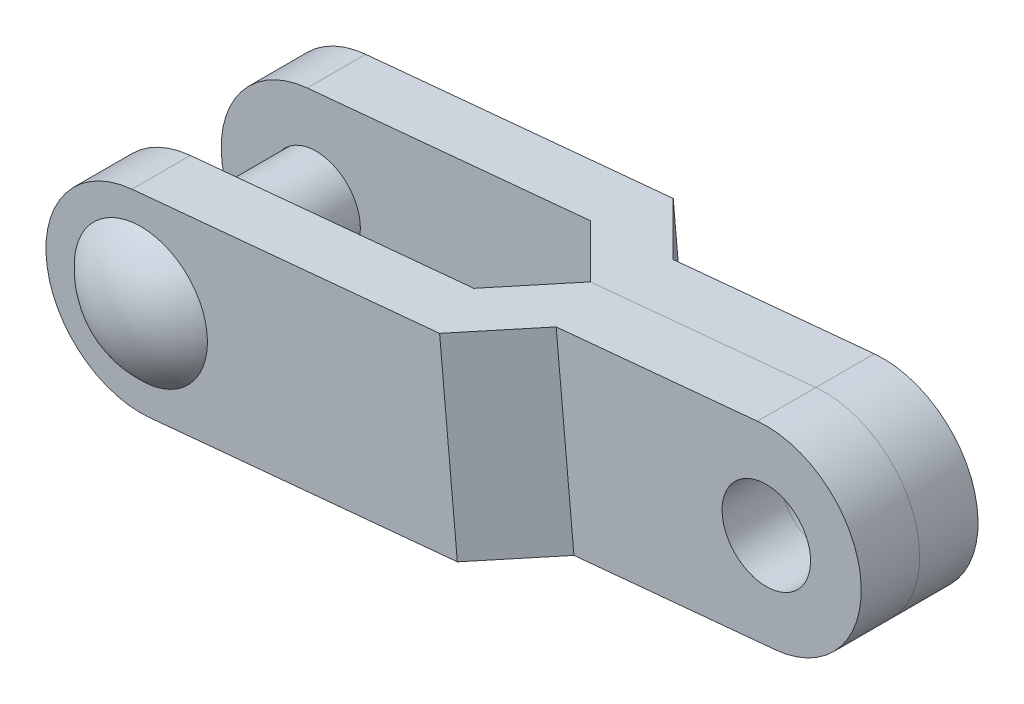
ISO-10303-21;
HEADER;
FILE_DESCRIPTION(('STEP AP214'),'2;1');
FILE_NAME('part.step','',(''),(''),'','','');
FILE_SCHEMA(('AUTOMOTIVE_DESIGN { 1 0 10303 214 1 1 1 1 }'));
ENDSEC;
DATA;
#1=APPLICATION_CONTEXT('core data for automotive mechanical design processes');
#2=APPLICATION_PROTOCOL_DEFINITION('international standard','automotive_design',2000,#1);
#3=PRODUCT_CONTEXT('',#1,'mechanical');
#4=PRODUCT('Part','Part','',(#3));
#5=PRODUCT_RELATED_PRODUCT_CATEGORY('part','',(#4));
#6=PRODUCT_DEFINITION_FORMATION('','',#4);
#7=PRODUCT_DEFINITION_CONTEXT('part definition',#1,'design');
#8=PRODUCT_DEFINITION('design','',#6,#7);
#9=PRODUCT_DEFINITION_SHAPE('','',#8);
#10=(LENGTH_UNIT() NAMED_UNIT(*) SI_UNIT(.MILLI.,.METRE.));
#11=(NAMED_UNIT(*) PLANE_ANGLE_UNIT() SI_UNIT($,.RADIAN.));
#12=(NAMED_UNIT(*) SI_UNIT($,.STERADIAN.) SOLID_ANGLE_UNIT());
#13=UNCERTAINTY_MEASURE_WITH_UNIT(LENGTH_MEASURE(1.E-05),#10,'distance_accuracy_value','');
#14=(GEOMETRIC_REPRESENTATION_CONTEXT(3) GLOBAL_UNCERTAINTY_ASSIGNED_CONTEXT((#13)) GLOBAL_UNIT_ASSIGNED_CONTEXT((#10,
#11,#12)) REPRESENTATION_CONTEXT('',''));
#15=CARTESIAN_POINT('',(0.,0.,0.));
#16=DIRECTION('',(0.,0.,1.));
#17=DIRECTION('',(1.,0.,0.));
#18=AXIS2_PLACEMENT_3D('',#15,#16,#17);
#19=CARTESIAN_POINT('',(33.5654439360264,20.3671347385643,2.00000000000023));
#20=DIRECTION('',(0.,0.,-1.));
#21=DIRECTION('',(-0.995601491019993,-0.0936892260549193,0.));
#22=AXIS2_PLACEMENT_3D('',#19,#20,#21);
#23=PLANE('',#22);
#24=CARTESIAN_POINT('',(30.6342290748899,16.8269399080709,2.00000000000026));
#25=DIRECTION('',(0.,0.,-1.));
#26=DIRECTION('',(-0.995601491019993,-0.0936892260549193,0.));
#27=AXIS2_PLACEMENT_3D('',#24,#25,#26);
#28=CIRCLE('',#27,1.515);
#29=CARTESIAN_POINT('',(32.1425653337852,16.9688790855441,2.00000000000024));
#30=VERTEX_POINT('',#29);
#31=EDGE_CURVE('P0_E135',#30,#30,#28,.T.);
#32=ORIENTED_EDGE('',*,*,#31,.T.);
#33=EDGE_LOOP('',(#32));
#34=FACE_BOUND('',#33,.T.);
#35=CARTESIAN_POINT('',(30.6342290748899,16.8269399080709,2.00000000000026));
#36=DIRECTION('',(0.,0.,-1.));
#37=DIRECTION('',(-0.995601491019993,-0.0936892260549193,0.));
#38=AXIS2_PLACEMENT_3D('',#35,#36,#37);
#39=CIRCLE('',#38,3.24999999999999);
#40=CARTESIAN_POINT('',(30.3297390902114,20.0626447538858,2.00000000000027));
#41=VERTEX_POINT('',#40);
#42=CARTESIAN_POINT('',(30.9387190595684,13.5912350622559,2.00000000000026));
#43=VERTEX_POINT('',#42);
#44=EDGE_CURVE('P0_E31',#41,#43,#39,.T.);
#45=ORIENTED_EDGE('',*,*,#44,.F.);
#46=DIRECTION('',(0.995601491019993,0.0936892260549193,0.));
#47=VECTOR('',#46,1.);
#48=CARTESIAN_POINT('',(33.5654439360264,20.3671347385643,2.00000000000023));
#49=LINE('',#48,#47);
#50=CARTESIAN_POINT('',(23.438610815405,19.4141679481206,2.00000000000033));
#51=VERTEX_POINT('',#50);
#52=EDGE_CURVE('P0_E145',#51,#41,#49,.T.);
#53=ORIENTED_EDGE('',*,*,#52,.F.);
#54=DIRECTION('',(0.0936892260549193,-0.995601491019993,0.));
#55=VECTOR('',#54,1.);
#56=CARTESIAN_POINT('',(23.438610815405,19.4141679481206,2.00000000000033));
#57=LINE('',#56,#55);
#58=CARTESIAN_POINT('',(24.0475907847619,12.9427582564906,2.00000000000034));
#59=VERTEX_POINT('',#58);
#60=EDGE_CURVE('P0_E130',#51,#59,#57,.T.);
#61=ORIENTED_EDGE('',*,*,#60,.T.);
#62=DIRECTION('',(0.995601491019993,0.0936892260549193,0.));
#63=VECTOR('',#62,1.);
#64=CARTESIAN_POINT('',(34.1744239053834,13.8957250469344,2.00000000000023));
#65=LINE('',#64,#63);
#66=EDGE_CURVE('P0_E111',#59,#43,#65,.T.);
#67=ORIENTED_EDGE('',*,*,#66,.T.);
#68=EDGE_LOOP('',(#45,#53,#61,#67));
#69=FACE_BOUND('',#68,.T.);
#70=ADVANCED_FACE('P0_F16',(#34,#69),#23,.F.);
#71=CARTESIAN_POINT('',(22.6138275348065,19.3365532519602,1.74187481183223E-13));
#72=DIRECTION('',(0.,0.,1.));
#73=DIRECTION('',(0.0936892260549193,-0.995601491019993,0.));
#74=AXIS2_PLACEMENT_3D('',#71,#72,#73);
#75=PLANE('',#74);
#76=CARTESIAN_POINT('',(30.6342290748899,16.8269399080709,1.11586825570534E-13));
#77=DIRECTION('',(0.,0.,1.));
#78=DIRECTION('',(0.0936892260549193,-0.995601491019993,0.));
#79=AXIS2_PLACEMENT_3D('',#76,#77,#78);
#80=CIRCLE('',#79,1.515);
#81=CARTESIAN_POINT('',(32.1425653337852,16.9688790855441,1.00613961606655E-13));
#82=VERTEX_POINT('',#81);
#83=EDGE_CURVE('P0_E133',#82,#82,#80,.T.);
#84=ORIENTED_EDGE('',*,*,#83,.T.);
#85=EDGE_LOOP('',(#84));
#86=FACE_BOUND('',#85,.T.);
#87=CARTESIAN_POINT('',(30.6342290748899,16.8269399080709,1.11586825570534E-13));
#88=DIRECTION('',(0.,0.,1.));
#89=DIRECTION('',(0.0936892260549193,-0.995601491019993,0.));
#90=AXIS2_PLACEMENT_3D('',#87,#88,#89);
#91=CIRCLE('',#90,3.24999999999999);
#92=CARTESIAN_POINT('',(30.9387190595684,13.5912350622559,1.11523091135607E-13));
#93=VERTEX_POINT('',#92);
#94=CARTESIAN_POINT('',(30.3297390902114,20.0626447538858,1.12517921743449E-13));
#95=VERTEX_POINT('',#94);
#96=EDGE_CURVE('P0_E95',#93,#95,#91,.T.);
#97=ORIENTED_EDGE('',*,*,#96,.F.);
#98=DIRECTION('',(-0.995601491019993,-0.0936892260549193,0.));
#99=VECTOR('',#98,1.);
#100=CARTESIAN_POINT('',(23.2228075041634,12.8651435603303,1.74060012313369E-13));
#101=LINE('',#100,#99);
#102=CARTESIAN_POINT('',(23.2228075041634,12.8651435603303,1.74060012313369E-13));
#103=VERTEX_POINT('',#102);
#104=EDGE_CURVE('P0_E115',#93,#103,#101,.T.);
#105=ORIENTED_EDGE('',*,*,#104,.T.);
#106=DIRECTION('',(0.0936892260549193,-0.995601491019993,0.));
#107=VECTOR('',#106,1.);
#108=CARTESIAN_POINT('',(22.6138275348065,19.3365532519602,1.74187481183223E-13));
#109=LINE('',#108,#107);
#110=CARTESIAN_POINT('',(22.6138275348065,19.3365532519602,1.74187481183223E-13));
#111=VERTEX_POINT('',#110);
#112=EDGE_CURVE('P0_E127',#111,#103,#109,.T.);
#113=ORIENTED_EDGE('',*,*,#112,.F.);
#114=DIRECTION('',(-0.995601491019993,-0.0936892260549193,0.));
#115=VECTOR('',#114,1.);
#116=CARTESIAN_POINT('',(22.6138275348065,19.3365532519602,1.74187481183223E-13));
#117=LINE('',#116,#115);
#118=EDGE_CURVE('P0_E158',#95,#111,#117,.T.);
#119=ORIENTED_EDGE('',*,*,#118,.F.);
#120=EDGE_LOOP('',(#97,#105,#113,#119));
#121=FACE_BOUND('',#120,.T.);
#122=ADVANCED_FACE('P0_F157',(#86,#121),#75,.F.);
#123=CARTESIAN_POINT('',(20.6226245527666,19.1491747998504,2.0000000000003));
#124=DIRECTION('',(0.,0.,1.));
#125=DIRECTION('',(0.995601491019993,0.0936892260549193,0.));
#126=AXIS2_PLACEMENT_3D('',#123,#124,#125);
#127=PLANE('',#126);
#128=CARTESIAN_POINT('',(11.22,14.9999999999999,2.00000000000034));
#129=DIRECTION('',(0.,0.,1.));
#130=DIRECTION('',(0.995601491019993,0.0936892260549193,0.));
#131=AXIS2_PLACEMENT_3D('',#128,#129,#130);
#132=CIRCLE('',#131,1.515);
#133=CARTESIAN_POINT('',(12.7283362588953,15.1419391774731,2.00000000000034));
#134=VERTEX_POINT('',#133);
#135=EDGE_CURVE('P0_E112',#134,#134,#132,.T.);
#136=ORIENTED_EDGE('',*,*,#135,.T.);
#137=EDGE_LOOP('',(#136));
#138=FACE_BOUND('',#137,.T.);
#139=CARTESIAN_POINT('',(11.22,14.9999999999999,2.00000000000034));
#140=DIRECTION('',(0.,0.,1.));
#141=DIRECTION('',(0.995601491019993,0.0936892260549193,0.));
#142=AXIS2_PLACEMENT_3D('',#139,#140,#141);
#143=CIRCLE('',#142,3.24999999999999);
#144=CARTESIAN_POINT('',(10.9155100153216,18.2357048458149,2.00000000000035));
#145=VERTEX_POINT('',#144);
#146=CARTESIAN_POINT('',(11.5244899846785,11.764295154185,2.00000000000034));
#147=VERTEX_POINT('',#146);
#148=EDGE_CURVE('P0_E38',#145,#147,#143,.T.);
#149=ORIENTED_EDGE('',*,*,#148,.F.);
#150=DIRECTION('',(-0.995601491019993,-0.0936892260549193,0.));
#151=VECTOR('',#150,1.);
#152=CARTESIAN_POINT('',(20.6226245527666,19.1491747998504,2.0000000000003));
#153=LINE('',#152,#151);
#154=CARTESIAN_POINT('',(20.6226245527666,19.1491747998504,2.0000000000003));
#155=VERTEX_POINT('',#154);
#156=EDGE_CURVE('P0_E94',#155,#145,#153,.T.);
#157=ORIENTED_EDGE('',*,*,#156,.F.);
#158=DIRECTION('',(0.0936892260549193,-0.995601491019993,0.));
#159=VECTOR('',#158,1.);
#160=CARTESIAN_POINT('',(20.6226245527666,19.1491747998504,2.0000000000003));
#161=LINE('',#160,#159);
#162=CARTESIAN_POINT('',(21.2316045221236,12.6777651082205,2.0000000000003));
#163=VERTEX_POINT('',#162);
#164=EDGE_CURVE('P0_E102',#155,#163,#161,.T.);
#165=ORIENTED_EDGE('',*,*,#164,.T.);
#166=DIRECTION('',(-0.995601491019993,-0.0936892260549193,0.));
#167=VECTOR('',#166,1.);
#168=CARTESIAN_POINT('',(21.2316045221236,12.6777651082205,2.0000000000003));
#169=LINE('',#168,#167);
#170=EDGE_CURVE('P0_E119',#163,#147,#169,.T.);
#171=ORIENTED_EDGE('',*,*,#170,.T.);
#172=EDGE_LOOP('',(#149,#157,#165,#171));
#173=FACE_BOUND('',#172,.T.);
#174=ADVANCED_FACE('P0_F149',(#138,#173),#127,.F.);
#175=CARTESIAN_POINT('',(21.4474078333653,19.2267894960108,4.00000000000036));
#176=DIRECTION('',(0.,0.,-1.));
#177=DIRECTION('',(-0.995601491019993,-0.0936892260549193,0.));
#178=AXIS2_PLACEMENT_3D('',#175,#176,#177);
#179=PLANE('',#178);
#180=CARTESIAN_POINT('',(11.22,14.9999999999999,4.00000000000035));
#181=DIRECTION('',(0.,0.,1.));
#182=DIRECTION('',(0.995601491019993,0.0936892260549193,0.));
#183=AXIS2_PLACEMENT_3D('',#180,#181,#182);
#184=CIRCLE('',#183,1.515);
#185=CARTESIAN_POINT('',(12.7283362588953,15.1419391774731,4.00000000000035));
#186=VERTEX_POINT('',#185);
#187=EDGE_CURVE('P0_E167',#186,#186,#184,.T.);
#188=ORIENTED_EDGE('',*,*,#187,.F.);
#189=EDGE_LOOP('',(#188));
#190=FACE_BOUND('',#189,.T.);
#191=CARTESIAN_POINT('',(11.22,14.9999999999999,4.00000000000035));
#192=DIRECTION('',(0.,0.,1.));
#193=DIRECTION('',(0.995601491019993,0.0936892260549193,0.));
#194=AXIS2_PLACEMENT_3D('',#191,#192,#193);
#195=CIRCLE('',#194,3.24999999999999);
#196=CARTESIAN_POINT('',(10.9155100153216,18.2357048458149,4.00000000000035));
#197=VERTEX_POINT('',#196);
#198=CARTESIAN_POINT('',(11.5244899846786,11.764295154185,4.00000000000035));
#199=VERTEX_POINT('',#198);
#200=EDGE_CURVE('P0_E78',#197,#199,#195,.T.);
#201=ORIENTED_EDGE('',*,*,#200,.T.);
#202=DIRECTION('',(0.995601491019993,0.0936892260549193,0.));
#203=VECTOR('',#202,1.);
#204=CARTESIAN_POINT('',(22.0563878027223,12.7553798043808,4.00000000000036));
#205=LINE('',#204,#203);
#206=CARTESIAN_POINT('',(22.0563878027223,12.7553798043808,4.00000000000036));
#207=VERTEX_POINT('',#206);
#208=EDGE_CURVE('P0_E122',#199,#207,#205,.T.);
#209=ORIENTED_EDGE('',*,*,#208,.T.);
#210=DIRECTION('',(0.0936892260549193,-0.995601491019993,0.));
#211=VECTOR('',#210,1.);
#212=CARTESIAN_POINT('',(21.4474078333653,19.2267894960108,4.00000000000036));
#213=LINE('',#212,#211);
#214=CARTESIAN_POINT('',(21.4474078333653,19.2267894960108,4.00000000000036));
#215=VERTEX_POINT('',#214);
#216=EDGE_CURVE('P0_E99',#215,#207,#213,.T.);
#217=ORIENTED_EDGE('',*,*,#216,.F.);
#218=DIRECTION('',(0.995601491019993,0.0936892260549193,0.));
#219=VECTOR('',#218,1.);
#220=CARTESIAN_POINT('',(21.4474078333653,19.2267894960108,4.00000000000036));
#221=LINE('',#220,#219);
#222=EDGE_CURVE('P0_E91',#197,#215,#221,.T.);
#223=ORIENTED_EDGE('',*,*,#222,.F.);
#224=EDGE_LOOP('',(#201,#209,#217,#223));
#225=FACE_BOUND('',#224,.T.);
#226=ADVANCED_FACE('P0_F97',(#190,#225),#179,.F.);
#227=CARTESIAN_POINT('',(21.4474078333653,19.2267894960108,4.00000000000036));
#228=DIRECTION('',(-0.0936892260549193,0.995601491019993,0.));
#229=DIRECTION('',(0.995601491019993,0.0936892260549193,0.));
#230=AXIS2_PLACEMENT_3D('',#227,#228,#229);
#231=PLANE('',#230);
#232=ORIENTED_EDGE('',*,*,#156,.T.);
#233=DIRECTION('',(0.,0.,1.));
#234=VECTOR('',#233,1.);
#235=CARTESIAN_POINT('',(10.9155100153216,18.2357048458149,-12.4999999999996));
#236=LINE('',#235,#234);
#237=EDGE_CURVE('P0_E81',#145,#197,#236,.T.);
#238=ORIENTED_EDGE('',*,*,#237,.T.);
#239=ORIENTED_EDGE('',*,*,#222,.T.);
#240=DIRECTION('',(0.703996565659611,0.0662482870675468,-0.707106781186612));
#241=VECTOR('',#240,1.);
#242=CARTESIAN_POINT('',(21.4474078333653,19.2267894960108,4.00000000000036));
#243=LINE('',#242,#241);
#244=EDGE_CURVE('P0_E123',#215,#51,#243,.T.);
#245=ORIENTED_EDGE('',*,*,#244,.T.);
#246=ORIENTED_EDGE('',*,*,#52,.T.);
#247=DIRECTION('',(0.,0.,1.));
#248=VECTOR('',#247,1.);
#249=CARTESIAN_POINT('',(30.3297390902114,20.0626447538858,-12.4999999999996));
#250=LINE('',#249,#248);
#251=EDGE_CURVE('P0_E85',#95,#41,#250,.T.);
#252=ORIENTED_EDGE('',*,*,#251,.F.);
#253=ORIENTED_EDGE('',*,*,#118,.T.);
#254=DIRECTION('',(-0.70399656565963,-0.0662482870675487,0.707106781186592));
#255=VECTOR('',#254,1.);
#256=CARTESIAN_POINT('',(20.6226245527666,19.1491747998504,2.0000000000003));
#257=LINE('',#256,#255);
#258=EDGE_CURVE('P0_E104',#111,#155,#257,.T.);
#259=ORIENTED_EDGE('',*,*,#258,.T.);
#260=EDGE_LOOP('',(#232,#238,#239,#245,#246,#252,#253,#259));
#261=FACE_BOUND('',#260,.T.);
#262=ADVANCED_FACE('P0_F89',(#261),#231,.T.);
#263=CARTESIAN_POINT('',(22.0563878027223,12.7553798043808,4.00000000000036));
#264=DIRECTION('',(-0.0936892260549193,0.995601491019993,0.));
#265=DIRECTION('',(0.995601491019993,0.0936892260549193,0.));
#266=AXIS2_PLACEMENT_3D('',#263,#264,#265);
#267=PLANE('',#266);
#268=DIRECTION('',(0.,0.,1.));
#269=VECTOR('',#268,1.);
#270=CARTESIAN_POINT('',(11.5244899846785,11.764295154185,-12.4999999999997));
#271=LINE('',#270,#269);
#272=EDGE_CURVE('P0_E11',#147,#199,#271,.T.);
#273=ORIENTED_EDGE('',*,*,#272,.F.);
#274=ORIENTED_EDGE('',*,*,#170,.F.);
#275=DIRECTION('',(-0.70399656565963,-0.0662482870675487,0.707106781186592));
#276=VECTOR('',#275,1.);
#277=CARTESIAN_POINT('',(21.2316045221236,12.6777651082205,2.0000000000003));
#278=LINE('',#277,#276);
#279=EDGE_CURVE('P0_E117',#103,#163,#278,.T.);
#280=ORIENTED_EDGE('',*,*,#279,.F.);
#281=ORIENTED_EDGE('',*,*,#104,.F.);
#282=DIRECTION('',(0.,0.,1.));
#283=VECTOR('',#282,1.);
#284=CARTESIAN_POINT('',(30.9387190595684,13.5912350622559,-12.4999999999996));
#285=LINE('',#284,#283);
#286=EDGE_CURVE('P0_E24',#93,#43,#285,.T.);
#287=ORIENTED_EDGE('',*,*,#286,.T.);
#288=ORIENTED_EDGE('',*,*,#66,.F.);
#289=DIRECTION('',(0.703996565659611,0.0662482870675468,-0.707106781186612));
#290=VECTOR('',#289,1.);
#291=CARTESIAN_POINT('',(22.0563878027223,12.7553798043808,4.00000000000036));
#292=LINE('',#291,#290);
#293=EDGE_CURVE('P0_E108',#207,#59,#292,.T.);
#294=ORIENTED_EDGE('',*,*,#293,.F.);
#295=ORIENTED_EDGE('',*,*,#208,.F.);
#296=EDGE_LOOP('',(#273,#274,#280,#281,#287,#288,#294,#295));
#297=FACE_BOUND('',#296,.T.);
#298=ADVANCED_FACE('P0_F138',(#297),#267,.F.);
#299=CARTESIAN_POINT('',(21.4474078333653,19.2267894960108,4.00000000000036));
#300=DIRECTION('',(-0.703996565659739,-0.0662482870675589,-0.707106781186483));
#301=DIRECTION('',(-0.703996565659611,-0.0662482870675468,0.707106781186612));
#302=AXIS2_PLACEMENT_3D('',#299,#300,#301);
#303=PLANE('',#302);
#304=ORIENTED_EDGE('',*,*,#293,.T.);
#305=ORIENTED_EDGE('',*,*,#60,.F.);
#306=ORIENTED_EDGE('',*,*,#244,.F.);
#307=ORIENTED_EDGE('',*,*,#216,.T.);
#308=EDGE_LOOP('',(#304,#305,#306,#307));
#309=FACE_BOUND('',#308,.T.);
#310=ADVANCED_FACE('P0_F18',(#309),#303,.F.);
#311=CARTESIAN_POINT('',(20.6226245527666,19.1491747998504,2.0000000000003));
#312=DIRECTION('',(0.70399656565972,0.066248287067557,0.707106781186502));
#313=DIRECTION('',(0.70399656565963,0.0662482870675487,-0.707106781186593));
#314=AXIS2_PLACEMENT_3D('',#311,#312,#313);
#315=PLANE('',#314);
#316=ORIENTED_EDGE('',*,*,#279,.T.);
#317=ORIENTED_EDGE('',*,*,#164,.F.);
#318=ORIENTED_EDGE('',*,*,#258,.F.);
#319=ORIENTED_EDGE('',*,*,#112,.T.);
#320=EDGE_LOOP('',(#316,#317,#318,#319));
#321=FACE_BOUND('',#320,.T.);
#322=ADVANCED_FACE('P0_F153',(#321),#315,.F.);
#323=CARTESIAN_POINT('',(11.22,14.9999999999999,-12.4999999999996));
#324=DIRECTION('',(0.,0.,1.));
#325=DIRECTION('',(0.995601491019993,0.0936892260549193,0.));
#326=AXIS2_PLACEMENT_3D('',#323,#324,#325);
#327=CYLINDRICAL_SURFACE('',#326,1.515);
#328=ORIENTED_EDGE('',*,*,#187,.T.);
#329=EDGE_LOOP('',(#328));
#330=FACE_BOUND('',#329,.T.);
#331=ORIENTED_EDGE('',*,*,#135,.F.);
#332=EDGE_LOOP('',(#331));
#333=FACE_BOUND('',#332,.T.);
#334=ADVANCED_FACE('P0_F184',(#330,#333),#327,.F.);
#335=CARTESIAN_POINT('',(30.6342290748899,16.8269399080709,-12.4999999999997));
#336=DIRECTION('',(0.,0.,1.));
#337=DIRECTION('',(0.995601491019993,0.0936892260549193,0.));
#338=AXIS2_PLACEMENT_3D('',#335,#336,#337);
#339=CYLINDRICAL_SURFACE('',#338,1.515);
#340=CARTESIAN_POINT('',(32.1425653337852,16.9688790855441,1.00613961606655E-13));
#341=CARTESIAN_POINT('',(32.1425653337852,16.9688790855441,0.0208333333334357));
#342=CARTESIAN_POINT('',(32.1425653337852,16.9688790855441,0.0416666666667708));
#343=CARTESIAN_POINT('',(32.1425653337852,16.9688790855441,0.0833333333334404));
#344=CARTESIAN_POINT('',(32.1425653337852,16.9688790855441,0.104166666666775));
#345=CARTESIAN_POINT('',(32.1425653337852,16.9688790855441,0.145833333333444));
#346=CARTESIAN_POINT('',(32.1425653337852,16.9688790855441,0.16666666666678));
#347=CARTESIAN_POINT('',(32.1425653337852,16.9688790855441,0.208333333333449));
#348=CARTESIAN_POINT('',(32.1425653337852,16.9688790855441,0.229166666666784));
#349=CARTESIAN_POINT('',(32.1425653337852,16.9688790855441,0.270833333333453));
#350=CARTESIAN_POINT('',(32.1425653337852,16.9688790855441,0.291666666666788));
#351=CARTESIAN_POINT('',(32.1425653337852,16.9688790855441,0.333333333333458));
#352=CARTESIAN_POINT('',(32.1425653337852,16.9688790855441,0.354166666666792));
#353=CARTESIAN_POINT('',(32.1425653337852,16.9688790855441,0.395833333333462));
#354=CARTESIAN_POINT('',(32.1425653337852,16.9688790855441,0.416666666666797));
#355=CARTESIAN_POINT('',(32.1425653337852,16.9688790855441,0.458333333333467));
#356=CARTESIAN_POINT('',(32.1425653337852,16.9688790855441,0.479166666666801));
#357=CARTESIAN_POINT('',(32.1425653337852,16.9688790855441,0.520833333333471));
#358=CARTESIAN_POINT('',(32.1425653337852,16.9688790855441,0.541666666666806));
#359=CARTESIAN_POINT('',(32.1425653337852,16.9688790855441,0.583333333333476));
#360=CARTESIAN_POINT('',(32.1425653337852,16.9688790855441,0.604166666666811));
#361=CARTESIAN_POINT('',(32.1425653337852,16.9688790855441,0.645833333333481));
#362=CARTESIAN_POINT('',(32.1425653337852,16.9688790855441,0.666666666666815));
#363=CARTESIAN_POINT('',(32.1425653337852,16.9688790855441,0.708333333333485));
#364=CARTESIAN_POINT('',(32.1425653337852,16.9688790855441,0.72916666666682));
#365=CARTESIAN_POINT('',(32.1425653337852,16.9688790855441,0.77083333333349));
#366=CARTESIAN_POINT('',(32.1425653337852,16.9688790855441,0.791666666666824));
#367=CARTESIAN_POINT('',(32.1425653337852,16.9688790855441,0.833333333333494));
#368=CARTESIAN_POINT('',(32.1425653337852,16.9688790855441,0.854166666666829));
#369=CARTESIAN_POINT('',(32.1425653337852,16.9688790855441,0.895833333333498));
#370=CARTESIAN_POINT('',(32.1425653337852,16.9688790855441,0.916666666666833));
#371=CARTESIAN_POINT('',(32.1425653337852,16.9688790855441,0.958333333333502));
#372=CARTESIAN_POINT('',(32.1425653337852,16.9688790855441,0.979166666666837));
#373=CARTESIAN_POINT('',(32.1425653337852,16.9688790855441,1.02083333333351));
#374=CARTESIAN_POINT('',(32.1425653337852,16.9688790855441,1.04166666666684));
#375=CARTESIAN_POINT('',(32.1425653337852,16.9688790855441,1.08333333333351));
#376=CARTESIAN_POINT('',(32.1425653337852,16.9688790855441,1.10416666666685));
#377=CARTESIAN_POINT('',(32.1425653337852,16.9688790855441,1.14583333333352));
#378=CARTESIAN_POINT('',(32.1425653337852,16.9688790855441,1.16666666666685));
#379=CARTESIAN_POINT('',(32.1425653337852,16.9688790855441,1.20833333333352));
#380=CARTESIAN_POINT('',(32.1425653337852,16.9688790855441,1.22916666666686));
#381=CARTESIAN_POINT('',(32.1425653337852,16.9688790855441,1.27083333333353));
#382=CARTESIAN_POINT('',(32.1425653337852,16.9688790855441,1.29166666666686));
#383=CARTESIAN_POINT('',(32.1425653337852,16.9688790855441,1.33333333333353));
#384=CARTESIAN_POINT('',(32.1425653337852,16.9688790855441,1.35416666666686));
#385=CARTESIAN_POINT('',(32.1425653337852,16.9688790855441,1.39583333333353));
#386=CARTESIAN_POINT('',(32.1425653337852,16.9688790855441,1.41666666666687));
#387=CARTESIAN_POINT('',(32.1425653337852,16.9688790855441,1.45833333333354));
#388=CARTESIAN_POINT('',(32.1425653337852,16.9688790855441,1.47916666666687));
#389=CARTESIAN_POINT('',(32.1425653337852,16.9688790855441,1.52083333333354));
#390=CARTESIAN_POINT('',(32.1425653337852,16.9688790855441,1.54166666666688));
#391=CARTESIAN_POINT('',(32.1425653337852,16.9688790855441,1.58333333333355));
#392=CARTESIAN_POINT('',(32.1425653337852,16.9688790855441,1.60416666666688));
#393=CARTESIAN_POINT('',(32.1425653337852,16.9688790855441,1.64583333333355));
#394=CARTESIAN_POINT('',(32.1425653337852,16.9688790855441,1.66666666666689));
#395=CARTESIAN_POINT('',(32.1425653337852,16.9688790855441,1.70833333333356));
#396=CARTESIAN_POINT('',(32.1425653337852,16.9688790855441,1.72916666666689));
#397=CARTESIAN_POINT('',(32.1425653337852,16.9688790855441,1.77083333333356));
#398=CARTESIAN_POINT('',(32.1425653337852,16.9688790855441,1.7916666666669));
#399=CARTESIAN_POINT('',(32.1425653337852,16.9688790855441,1.83333333333357));
#400=CARTESIAN_POINT('',(32.1425653337852,16.9688790855441,1.8541666666669));
#401=CARTESIAN_POINT('',(32.1425653337852,16.9688790855441,1.89583333333357));
#402=CARTESIAN_POINT('',(32.1425653337852,16.9688790855441,1.91666666666691));
#403=CARTESIAN_POINT('',(32.1425653337852,16.9688790855441,1.95833333333358));
#404=CARTESIAN_POINT('',(32.1425653337852,16.9688790855441,1.97916666666691));
#405=CARTESIAN_POINT('',(32.1425653337852,16.9688790855441,2.00000000000024));
#406=B_SPLINE_CURVE_WITH_KNOTS('',3,(#340,#341,#342,#343,#344,#345,#346,#347,#348,#349,#350,
#351,#352,#353,#354,#355,#356,#357,#358,#359,#360,#361,#362,#363,#364,#365,#366,#367,#368,#369,
#370,#371,#372,#373,#374,#375,#376,#377,#378,#379,#380,#381,#382,#383,#384,#385,#386,#387,#388,
#389,#390,#391,#392,#393,#394,#395,#396,#397,#398,#399,#400,#401,#402,#403,#404,#405),
.UNSPECIFIED.,.F.,.F.,(4,2,2,2,2,2,2,2,2,2,2,2,2,2,2,2,2,2,2,2,2,2,2,2,2,2,2,2,2,2,2,2,4),(0.,
0.0625000000000053,0.125000000000009,0.187500000000014,0.250000000000018,0.312500000000023,
0.375000000000026,0.437500000000032,0.500000000000035,0.56250000000004,0.625000000000046,
0.687500000000049,0.750000000000054,0.812500000000058,0.875000000000063,0.937500000000067,
1.00000000000007,1.06250000000008,1.12500000000008,1.18750000000009,1.25000000000009,
1.31250000000009,1.3750000000001,1.4375000000001,1.50000000000011,1.56250000000011,
1.62500000000012,1.68750000000012,1.75000000000013,1.81250000000013,1.87500000000014,
1.93750000000014,2.00000000000014),.UNSPECIFIED.);
#407=EDGE_CURVE('P0_BSEAM176',#82,#30,#406,.T.);
#408=ORIENTED_EDGE('',*,*,#83,.F.);
#409=ORIENTED_EDGE('',*,*,#31,.F.);
#410=ORIENTED_EDGE('',*,*,#407,.T.);
#411=ORIENTED_EDGE('',*,*,#407,.F.);
#412=EDGE_LOOP('',(#408,#410,#409,#411));
#413=FACE_BOUND('',#412,.T.);
#414=ADVANCED_FACE('P0_F176',(#413),#339,.F.);
#415=CARTESIAN_POINT('',(30.6342290748899,16.8269399080709,-12.4999999999997));
#416=DIRECTION('',(0.,0.,1.));
#417=DIRECTION('',(0.995601491019993,0.0936892260549193,0.));
#418=AXIS2_PLACEMENT_3D('',#415,#416,#417);
#419=CYLINDRICAL_SURFACE('',#418,3.24999999999999);
#420=ORIENTED_EDGE('',*,*,#44,.T.);
#421=ORIENTED_EDGE('',*,*,#286,.F.);
#422=ORIENTED_EDGE('',*,*,#96,.T.);
#423=ORIENTED_EDGE('',*,*,#251,.T.);
#424=EDGE_LOOP('',(#420,#421,#422,#423));
#425=FACE_BOUND('',#424,.T.);
#426=ADVANCED_FACE('P0_F174',(#425),#419,.T.);
#427=CARTESIAN_POINT('',(11.22,14.9999999999999,-12.4999999999996));
#428=DIRECTION('',(0.,0.,1.));
#429=DIRECTION('',(0.995601491019993,0.0936892260549193,0.));
#430=AXIS2_PLACEMENT_3D('',#427,#428,#429);
#431=CYLINDRICAL_SURFACE('',#430,3.24999999999999);
#432=ORIENTED_EDGE('',*,*,#148,.T.);
#433=ORIENTED_EDGE('',*,*,#272,.T.);
#434=ORIENTED_EDGE('',*,*,#200,.F.);
#435=ORIENTED_EDGE('',*,*,#237,.F.);
#436=EDGE_LOOP('',(#432,#433,#434,#435));
#437=FACE_BOUND('',#436,.T.);
#438=ADVANCED_FACE('P0_F80',(#437),#431,.T.);
#439=CLOSED_SHELL('',(#70,#122,#174,#226,#262,#298,#310,#322,#334,#414,#426,#438));
#440=MANIFOLD_SOLID_BREP('P0_B1',#439);
#441=CARTESIAN_POINT('',(33.5654439360264,20.3671347385644,-2.));
#442=DIRECTION('',(0.,0.,1.));
#443=DIRECTION('',(-0.995601491019994,-0.0936892260549191,0.));
#444=AXIS2_PLACEMENT_3D('',#441,#442,#443);
#445=PLANE('',#444);
#446=CARTESIAN_POINT('',(30.6342290748899,16.8269399080709,-2.00000000000004));
#447=DIRECTION('',(0.,0.,-1.));
#448=DIRECTION('',(-0.995601491019994,-0.0936892260549191,0.));
#449=AXIS2_PLACEMENT_3D('',#446,#447,#448);
#450=CIRCLE('',#449,1.515);
#451=CARTESIAN_POINT('',(32.1425653337852,16.9688790855441,-2.00000000000002));
#452=VERTEX_POINT('',#451);
#453=EDGE_CURVE('P1_E115',#452,#452,#450,.T.);
#454=ORIENTED_EDGE('',*,*,#453,.F.);
#455=EDGE_LOOP('',(#454));
#456=FACE_BOUND('',#455,.T.);
#457=CARTESIAN_POINT('',(30.6342290748899,16.8269399080709,-2.00000000000004));
#458=DIRECTION('',(0.,0.,-1.));
#459=DIRECTION('',(-0.995601491019994,-0.0936892260549191,0.));
#460=AXIS2_PLACEMENT_3D('',#457,#458,#459);
#461=CIRCLE('',#460,3.24999999999999);
#462=CARTESIAN_POINT('',(30.3297390902114,20.0626447538858,-2.00000000000004));
#463=VERTEX_POINT('',#462);
#464=CARTESIAN_POINT('',(30.9387190595684,13.5912350622559,-2.00000000000004));
#465=VERTEX_POINT('',#464);
#466=EDGE_CURVE('P1_E110',#463,#465,#461,.T.);
#467=ORIENTED_EDGE('',*,*,#466,.T.);
#468=DIRECTION('',(0.995601491019994,0.0936892260549191,0.));
#469=VECTOR('',#468,1.);
#470=CARTESIAN_POINT('',(34.1744239053834,13.8957250469344,-2.));
#471=LINE('',#470,#469);
#472=CARTESIAN_POINT('',(24.0475907847619,12.9427582564906,-2.00000000000011));
#473=VERTEX_POINT('',#472);
#474=EDGE_CURVE('P1_E136',#473,#465,#471,.T.);
#475=ORIENTED_EDGE('',*,*,#474,.F.);
#476=DIRECTION('',(0.0936892260549191,-0.995601491019994,0.));
#477=VECTOR('',#476,1.);
#478=CARTESIAN_POINT('',(23.438610815405,19.4141679481206,-2.00000000000011));
#479=LINE('',#478,#477);
#480=CARTESIAN_POINT('',(23.438610815405,19.4141679481206,-2.00000000000011));
#481=VERTEX_POINT('',#480);
#482=EDGE_CURVE('P1_E153',#481,#473,#479,.T.);
#483=ORIENTED_EDGE('',*,*,#482,.F.);
#484=DIRECTION('',(0.995601491019994,0.0936892260549191,0.));
#485=VECTOR('',#484,1.);
#486=CARTESIAN_POINT('',(33.5654439360264,20.3671347385644,-2.));
#487=LINE('',#486,#485);
#488=EDGE_CURVE('P1_E126',#481,#463,#487,.T.);
#489=ORIENTED_EDGE('',*,*,#488,.T.);
#490=EDGE_LOOP('',(#467,#475,#483,#489));
#491=FACE_BOUND('',#490,.T.);
#492=ADVANCED_FACE('P1_F16',(#456,#491),#445,.F.);
#493=CARTESIAN_POINT('',(22.6138275348065,19.3365532519602,0.));
#494=DIRECTION('',(0.,0.,-1.));
#495=DIRECTION('',(0.0936892260549191,-0.995601491019994,0.));
#496=AXIS2_PLACEMENT_3D('',#493,#494,#495);
#497=PLANE('',#496);
#498=CARTESIAN_POINT('',(30.6342290748899,16.8269399080709,1.10330510570337E-13));
#499=DIRECTION('',(0.,0.,1.));
#500=DIRECTION('',(0.0936892260549191,-0.995601491019994,0.));
#501=AXIS2_PLACEMENT_3D('',#498,#499,#500);
#502=CIRCLE('',#501,1.515);
#503=CARTESIAN_POINT('',(32.1425653337852,16.9688790855441,1.21430643318376E-13));
#504=VERTEX_POINT('',#503);
#505=EDGE_CURVE('P1_E114',#504,#504,#502,.T.);
#506=ORIENTED_EDGE('',*,*,#505,.F.);
#507=EDGE_LOOP('',(#506));
#508=FACE_BOUND('',#507,.T.);
#509=CARTESIAN_POINT('',(30.6342290748899,16.8269399080709,1.10330510570337E-13));
#510=DIRECTION('',(0.,0.,1.));
#511=DIRECTION('',(0.0936892260549191,-0.995601491019994,0.));
#512=AXIS2_PLACEMENT_3D('',#509,#510,#511);
#513=CIRCLE('',#512,3.24999999999999);
#514=CARTESIAN_POINT('',(30.9387190595684,13.5912350622559,1.1073822562354E-13));
#515=VERTEX_POINT('',#514);
#516=CARTESIAN_POINT('',(30.3297390902114,20.0626447538858,1.12524880731098E-13));
#517=VERTEX_POINT('',#516);
#518=EDGE_CURVE('P1_E87',#515,#517,#513,.T.);
#519=ORIENTED_EDGE('',*,*,#518,.T.);
#520=DIRECTION('',(-0.995601491019994,-0.0936892260549191,0.));
#521=VECTOR('',#520,1.);
#522=CARTESIAN_POINT('',(22.6138275348065,19.3365532519602,0.));
#523=LINE('',#522,#521);
#524=CARTESIAN_POINT('',(22.6138275348065,19.3365532519602,0.));
#525=VERTEX_POINT('',#524);
#526=EDGE_CURVE('P1_E129',#517,#525,#523,.T.);
#527=ORIENTED_EDGE('',*,*,#526,.T.);
#528=DIRECTION('',(0.0936892260549191,-0.995601491019994,0.));
#529=VECTOR('',#528,1.);
#530=CARTESIAN_POINT('',(22.6138275348065,19.3365532519602,0.));
#531=LINE('',#530,#529);
#532=CARTESIAN_POINT('',(23.2228075041635,12.8651435603303,0.));
#533=VERTEX_POINT('',#532);
#534=EDGE_CURVE('P1_E150',#525,#533,#531,.T.);
#535=ORIENTED_EDGE('',*,*,#534,.T.);
#536=DIRECTION('',(-0.995601491019994,-0.0936892260549191,0.));
#537=VECTOR('',#536,1.);
#538=CARTESIAN_POINT('',(23.2228075041635,12.8651435603303,0.));
#539=LINE('',#538,#537);
#540=EDGE_CURVE('P1_E138',#515,#533,#539,.T.);
#541=ORIENTED_EDGE('',*,*,#540,.F.);
#542=EDGE_LOOP('',(#519,#527,#535,#541));
#543=FACE_BOUND('',#542,.T.);
#544=ADVANCED_FACE('P1_F162',(#508,#543),#497,.F.);
#545=CARTESIAN_POINT('',(20.6226245527666,19.1491747998504,-2.00000000000008));
#546=DIRECTION('',(0.,0.,-1.));
#547=DIRECTION('',(0.995601491019994,0.0936892260549191,0.));
#548=AXIS2_PLACEMENT_3D('',#545,#546,#547);
#549=PLANE('',#548);
#550=CARTESIAN_POINT('',(11.22,14.9999999999999,-2.00000000000012));
#551=DIRECTION('',(0.,0.,1.));
#552=DIRECTION('',(0.995601491019994,0.0936892260549191,0.));
#553=AXIS2_PLACEMENT_3D('',#550,#551,#552);
#554=CIRCLE('',#553,1.515);
#555=CARTESIAN_POINT('',(12.7283362588953,15.1419391774731,-2.00000000000011));
#556=VERTEX_POINT('',#555);
#557=EDGE_CURVE('P1_E121',#556,#556,#554,.T.);
#558=ORIENTED_EDGE('',*,*,#557,.F.);
#559=EDGE_LOOP('',(#558));
#560=FACE_BOUND('',#559,.T.);
#561=CARTESIAN_POINT('',(11.22,14.9999999999999,-2.00000000000012));
#562=DIRECTION('',(0.,0.,1.));
#563=DIRECTION('',(0.995601491019994,0.0936892260549191,0.));
#564=AXIS2_PLACEMENT_3D('',#561,#562,#563);
#565=CIRCLE('',#564,3.24999999999999);
#566=CARTESIAN_POINT('',(10.9155100153216,18.2357048458149,-2.00000000000013));
#567=VERTEX_POINT('',#566);
#568=CARTESIAN_POINT('',(11.5244899846785,11.764295154185,-2.00000000000012));
#569=VERTEX_POINT('',#568);
#570=EDGE_CURVE('P1_E83',#567,#569,#565,.T.);
#571=ORIENTED_EDGE('',*,*,#570,.T.);
#572=DIRECTION('',(-0.995601491019994,-0.0936892260549191,0.));
#573=VECTOR('',#572,1.);
#574=CARTESIAN_POINT('',(21.2316045221236,12.6777651082204,-2.00000000000008));
#575=LINE('',#574,#573);
#576=CARTESIAN_POINT('',(21.2316045221236,12.6777651082204,-2.00000000000008));
#577=VERTEX_POINT('',#576);
#578=EDGE_CURVE('P1_E143',#577,#569,#575,.T.);
#579=ORIENTED_EDGE('',*,*,#578,.F.);
#580=DIRECTION('',(0.0936892260549191,-0.995601491019994,0.));
#581=VECTOR('',#580,1.);
#582=CARTESIAN_POINT('',(20.6226245527666,19.1491747998504,-2.00000000000008));
#583=LINE('',#582,#581);
#584=CARTESIAN_POINT('',(20.6226245527666,19.1491747998504,-2.00000000000008));
#585=VERTEX_POINT('',#584);
#586=EDGE_CURVE('P1_E147',#585,#577,#583,.T.);
#587=ORIENTED_EDGE('',*,*,#586,.F.);
#588=DIRECTION('',(-0.995601491019994,-0.0936892260549191,0.));
#589=VECTOR('',#588,1.);
#590=CARTESIAN_POINT('',(20.6226245527666,19.1491747998504,-2.00000000000008));
#591=LINE('',#590,#589);
#592=EDGE_CURVE('P1_E99',#585,#567,#591,.T.);
#593=ORIENTED_EDGE('',*,*,#592,.T.);
#594=EDGE_LOOP('',(#571,#579,#587,#593));
#595=FACE_BOUND('',#594,.T.);
#596=ADVANCED_FACE('P1_F165',(#560,#595),#549,.F.);
#597=CARTESIAN_POINT('',(21.4474078333653,19.2267894960108,-4.00000000000013));
#598=DIRECTION('',(0.,0.,1.));
#599=DIRECTION('',(-0.995601491019994,-0.0936892260549191,0.));
#600=AXIS2_PLACEMENT_3D('',#597,#598,#599);
#601=PLANE('',#600);
#602=CARTESIAN_POINT('',(11.22,14.9999999999999,-4.00000000000013));
#603=DIRECTION('',(0.,0.,1.));
#604=DIRECTION('',(0.995601491019994,0.0936892260549191,0.));
#605=AXIS2_PLACEMENT_3D('',#602,#603,#604);
#606=CIRCLE('',#605,1.515);
#607=CARTESIAN_POINT('',(12.7283362588953,15.1419391774731,-4.00000000000013));
#608=VERTEX_POINT('',#607);
#609=EDGE_CURVE('P1_E118',#608,#608,#606,.T.);
#610=ORIENTED_EDGE('',*,*,#609,.T.);
#611=EDGE_LOOP('',(#610));
#612=FACE_BOUND('',#611,.T.);
#613=CARTESIAN_POINT('',(11.22,14.9999999999999,-4.00000000000013));
#614=DIRECTION('',(0.,0.,1.));
#615=DIRECTION('',(0.995601491019994,0.0936892260549191,0.));
#616=AXIS2_PLACEMENT_3D('',#613,#614,#615);
#617=CIRCLE('',#616,3.24999999999999);
#618=CARTESIAN_POINT('',(10.9155100153216,18.2357048458149,-4.00000000000013));
#619=VERTEX_POINT('',#618);
#620=CARTESIAN_POINT('',(11.5244899846786,11.764295154185,-4.00000000000013));
#621=VERTEX_POINT('',#620);
#622=EDGE_CURVE('P1_E81',#619,#621,#617,.T.);
#623=ORIENTED_EDGE('',*,*,#622,.F.);
#624=DIRECTION('',(0.995601491019994,0.0936892260549191,0.));
#625=VECTOR('',#624,1.);
#626=CARTESIAN_POINT('',(21.4474078333653,19.2267894960108,-4.00000000000013));
#627=LINE('',#626,#625);
#628=CARTESIAN_POINT('',(21.4474078333653,19.2267894960108,-4.00000000000013));
#629=VERTEX_POINT('',#628);
#630=EDGE_CURVE('P1_E91',#619,#629,#627,.T.);
#631=ORIENTED_EDGE('',*,*,#630,.T.);
#632=DIRECTION('',(0.0936892260549191,-0.995601491019994,0.));
#633=VECTOR('',#632,1.);
#634=CARTESIAN_POINT('',(21.4474078333653,19.2267894960108,-4.00000000000013));
#635=LINE('',#634,#633);
#636=CARTESIAN_POINT('',(22.0563878027223,12.7553798043808,-4.00000000000013));
#637=VERTEX_POINT('',#636);
#638=EDGE_CURVE('P1_E98',#629,#637,#635,.T.);
#639=ORIENTED_EDGE('',*,*,#638,.T.);
#640=DIRECTION('',(0.995601491019994,0.0936892260549191,0.));
#641=VECTOR('',#640,1.);
#642=CARTESIAN_POINT('',(22.0563878027223,12.7553798043808,-4.00000000000013));
#643=LINE('',#642,#641);
#644=EDGE_CURVE('P1_E104',#621,#637,#643,.T.);
#645=ORIENTED_EDGE('',*,*,#644,.F.);
#646=EDGE_LOOP('',(#623,#631,#639,#645));
#647=FACE_BOUND('',#646,.T.);
#648=ADVANCED_FACE('P1_F102',(#612,#647),#601,.F.);
#649=CARTESIAN_POINT('',(21.4474078333653,19.2267894960108,-4.00000000000013));
#650=DIRECTION('',(-0.0936892260549191,0.995601491019994,0.));
#651=DIRECTION('',(0.995601491019994,0.0936892260549191,0.));
#652=AXIS2_PLACEMENT_3D('',#649,#650,#651);
#653=PLANE('',#652);
#654=ORIENTED_EDGE('',*,*,#592,.F.);
#655=DIRECTION('',(-0.70399656565963,-0.0662482870675485,-0.707106781186592));
#656=VECTOR('',#655,1.);
#657=CARTESIAN_POINT('',(20.6226245527666,19.1491747998504,-2.00000000000008));
#658=LINE('',#657,#656);
#659=EDGE_CURVE('P1_E132',#525,#585,#658,.T.);
#660=ORIENTED_EDGE('',*,*,#659,.F.);
#661=ORIENTED_EDGE('',*,*,#526,.F.);
#662=DIRECTION('',(0.,0.,-1.));
#663=VECTOR('',#662,1.);
#664=CARTESIAN_POINT('',(30.3297390902114,20.0626447538858,12.4999999999999));
#665=LINE('',#664,#663);
#666=EDGE_CURVE('P1_E88',#517,#463,#665,.T.);
#667=ORIENTED_EDGE('',*,*,#666,.T.);
#668=ORIENTED_EDGE('',*,*,#488,.F.);
#669=DIRECTION('',(0.703996565659611,0.0662482870675466,0.707106781186612));
#670=VECTOR('',#669,1.);
#671=CARTESIAN_POINT('',(21.4474078333653,19.2267894960108,-4.00000000000013));
#672=LINE('',#671,#670);
#673=EDGE_CURVE('P1_E94',#629,#481,#672,.T.);
#674=ORIENTED_EDGE('',*,*,#673,.F.);
#675=ORIENTED_EDGE('',*,*,#630,.F.);
#676=DIRECTION('',(0.,0.,-1.));
#677=VECTOR('',#676,1.);
#678=CARTESIAN_POINT('',(10.9155100153216,18.2357048458149,12.4999999999999));
#679=LINE('',#678,#677);
#680=EDGE_CURVE('P1_E77',#567,#619,#679,.T.);
#681=ORIENTED_EDGE('',*,*,#680,.F.);
#682=EDGE_LOOP('',(#654,#660,#661,#667,#668,#674,#675,#681));
#683=FACE_BOUND('',#682,.T.);
#684=ADVANCED_FACE('P1_F92',(#683),#653,.T.);
#685=CARTESIAN_POINT('',(22.0563878027223,12.7553798043808,-4.00000000000013));
#686=DIRECTION('',(-0.0936892260549191,0.995601491019994,0.));
#687=DIRECTION('',(0.995601491019994,0.0936892260549191,0.));
#688=AXIS2_PLACEMENT_3D('',#685,#686,#687);
#689=PLANE('',#688);
#690=DIRECTION('',(0.,0.,-1.));
#691=VECTOR('',#690,1.);
#692=CARTESIAN_POINT('',(11.5244899846785,11.764295154185,12.4999999999999));
#693=LINE('',#692,#691);
#694=EDGE_CURVE('P1_E11',#569,#621,#693,.T.);
#695=ORIENTED_EDGE('',*,*,#694,.T.);
#696=ORIENTED_EDGE('',*,*,#644,.T.);
#697=DIRECTION('',(0.703996565659611,0.0662482870675466,0.707106781186612));
#698=VECTOR('',#697,1.);
#699=CARTESIAN_POINT('',(22.0563878027223,12.7553798043808,-4.00000000000013));
#700=LINE('',#699,#698);
#701=EDGE_CURVE('P1_E124',#637,#473,#700,.T.);
#702=ORIENTED_EDGE('',*,*,#701,.T.);
#703=ORIENTED_EDGE('',*,*,#474,.T.);
#704=DIRECTION('',(0.,0.,-1.));
#705=VECTOR('',#704,1.);
#706=CARTESIAN_POINT('',(30.9387190595684,13.5912350622559,12.4999999999999));
#707=LINE('',#706,#705);
#708=EDGE_CURVE('P1_E24',#515,#465,#707,.T.);
#709=ORIENTED_EDGE('',*,*,#708,.F.);
#710=ORIENTED_EDGE('',*,*,#540,.T.);
#711=DIRECTION('',(-0.70399656565963,-0.0662482870675485,-0.707106781186592));
#712=VECTOR('',#711,1.);
#713=CARTESIAN_POINT('',(21.2316045221236,12.6777651082204,-2.00000000000008));
#714=LINE('',#713,#712);
#715=EDGE_CURVE('P1_E141',#533,#577,#714,.T.);
#716=ORIENTED_EDGE('',*,*,#715,.T.);
#717=ORIENTED_EDGE('',*,*,#578,.T.);
#718=EDGE_LOOP('',(#695,#696,#702,#703,#709,#710,#716,#717));
#719=FACE_BOUND('',#718,.T.);
#720=ADVANCED_FACE('P1_F176',(#719),#689,.F.);
#721=CARTESIAN_POINT('',(21.4474078333653,19.2267894960108,-4.00000000000013));
#722=DIRECTION('',(-0.703996565659739,-0.0662482870675589,0.707106781186483));
#723=DIRECTION('',(-0.703996565659611,-0.0662482870675466,-0.707106781186612));
#724=AXIS2_PLACEMENT_3D('',#721,#722,#723);
#725=PLANE('',#724);
#726=ORIENTED_EDGE('',*,*,#701,.F.);
#727=ORIENTED_EDGE('',*,*,#638,.F.);
#728=ORIENTED_EDGE('',*,*,#673,.T.);
#729=ORIENTED_EDGE('',*,*,#482,.T.);
#730=EDGE_LOOP('',(#726,#727,#728,#729));
#731=FACE_BOUND('',#730,.T.);
#732=ADVANCED_FACE('P1_F18',(#731),#725,.F.);
#733=CARTESIAN_POINT('',(20.6226245527666,19.1491747998504,-2.00000000000008));
#734=DIRECTION('',(0.70399656565972,0.066248287067557,-0.707106781186502));
#735=DIRECTION('',(0.70399656565963,0.0662482870675485,0.707106781186593));
#736=AXIS2_PLACEMENT_3D('',#733,#734,#735);
#737=PLANE('',#736);
#738=ORIENTED_EDGE('',*,*,#715,.F.);
#739=ORIENTED_EDGE('',*,*,#534,.F.);
#740=ORIENTED_EDGE('',*,*,#659,.T.);
#741=ORIENTED_EDGE('',*,*,#586,.T.);
#742=EDGE_LOOP('',(#738,#739,#740,#741));
#743=FACE_BOUND('',#742,.T.);
#744=ADVANCED_FACE('P1_F173',(#743),#737,.F.);
#745=CARTESIAN_POINT('',(11.22,14.9999999999999,12.4999999999999));
#746=DIRECTION('',(0.,0.,-1.));
#747=DIRECTION('',(0.995601491019994,0.0936892260549191,0.));
#748=AXIS2_PLACEMENT_3D('',#745,#746,#747);
#749=CYLINDRICAL_SURFACE('',#748,1.515);
#750=ORIENTED_EDGE('',*,*,#609,.F.);
#751=EDGE_LOOP('',(#750));
#752=FACE_BOUND('',#751,.T.);
#753=ORIENTED_EDGE('',*,*,#557,.T.);
#754=EDGE_LOOP('',(#753));
#755=FACE_BOUND('',#754,.T.);
#756=ADVANCED_FACE('P1_F199',(#752,#755),#749,.F.);
#757=CARTESIAN_POINT('',(30.6342290748899,16.8269399080709,12.4999999999999));
#758=DIRECTION('',(0.,0.,-1.));
#759=DIRECTION('',(0.995601491019994,0.0936892260549191,0.));
#760=AXIS2_PLACEMENT_3D('',#757,#758,#759);
#761=CYLINDRICAL_SURFACE('',#760,1.515);
#762=CARTESIAN_POINT('',(32.1425653337852,16.9688790855441,1.21430643318376E-13));
#763=CARTESIAN_POINT('',(32.1425653337852,16.9688790855441,-0.0208333333332137));
#764=CARTESIAN_POINT('',(32.1425653337852,16.9688790855441,-0.0416666666665488));
#765=CARTESIAN_POINT('',(32.1425653337852,16.9688790855441,-0.0833333333332183));
#766=CARTESIAN_POINT('',(32.1425653337852,16.9688790855441,-0.104166666666553));
#767=CARTESIAN_POINT('',(32.1425653337852,16.9688790855441,-0.145833333333222));
#768=CARTESIAN_POINT('',(32.1425653337852,16.9688790855441,-0.166666666666558));
#769=CARTESIAN_POINT('',(32.1425653337852,16.9688790855441,-0.208333333333227));
#770=CARTESIAN_POINT('',(32.1425653337852,16.9688790855441,-0.229166666666562));
#771=CARTESIAN_POINT('',(32.1425653337852,16.9688790855441,-0.270833333333231));
#772=CARTESIAN_POINT('',(32.1425653337852,16.9688790855441,-0.291666666666566));
#773=CARTESIAN_POINT('',(32.1425653337852,16.9688790855441,-0.333333333333236));
#774=CARTESIAN_POINT('',(32.1425653337852,16.9688790855441,-0.35416666666657));
#775=CARTESIAN_POINT('',(32.1425653337852,16.9688790855441,-0.39583333333324));
#776=CARTESIAN_POINT('',(32.1425653337852,16.9688790855441,-0.416666666666575));
#777=CARTESIAN_POINT('',(32.1425653337852,16.9688790855441,-0.458333333333245));
#778=CARTESIAN_POINT('',(32.1425653337852,16.9688790855441,-0.479166666666579));
#779=CARTESIAN_POINT('',(32.1425653337852,16.9688790855441,-0.520833333333249));
#780=CARTESIAN_POINT('',(32.1425653337852,16.9688790855441,-0.541666666666584));
#781=CARTESIAN_POINT('',(32.1425653337852,16.9688790855441,-0.583333333333254));
#782=CARTESIAN_POINT('',(32.1425653337852,16.9688790855441,-0.604166666666589));
#783=CARTESIAN_POINT('',(32.1425653337852,16.9688790855441,-0.645833333333259));
#784=CARTESIAN_POINT('',(32.1425653337852,16.9688790855441,-0.666666666666593));
#785=CARTESIAN_POINT('',(32.1425653337852,16.9688790855441,-0.708333333333263));
#786=CARTESIAN_POINT('',(32.1425653337852,16.9688790855441,-0.729166666666598));
#787=CARTESIAN_POINT('',(32.1425653337852,16.9688790855441,-0.770833333333268));
#788=CARTESIAN_POINT('',(32.1425653337852,16.9688790855441,-0.791666666666602));
#789=CARTESIAN_POINT('',(32.1425653337852,16.9688790855441,-0.833333333333272));
#790=CARTESIAN_POINT('',(32.1425653337852,16.9688790855441,-0.854166666666607));
#791=CARTESIAN_POINT('',(32.1425653337852,16.9688790855441,-0.895833333333276));
#792=CARTESIAN_POINT('',(32.1425653337852,16.9688790855441,-0.916666666666611));
#793=CARTESIAN_POINT('',(32.1425653337852,16.9688790855441,-0.95833333333328));
#794=CARTESIAN_POINT('',(32.1425653337852,16.9688790855441,-0.979166666666615));
#795=CARTESIAN_POINT('',(32.1425653337852,16.9688790855441,-1.02083333333329));
#796=CARTESIAN_POINT('',(32.1425653337852,16.9688790855441,-1.04166666666662));
#797=CARTESIAN_POINT('',(32.1425653337852,16.9688790855441,-1.08333333333329));
#798=CARTESIAN_POINT('',(32.1425653337852,16.9688790855441,-1.10416666666662));
#799=CARTESIAN_POINT('',(32.1425653337852,16.9688790855441,-1.14583333333329));
#800=CARTESIAN_POINT('',(32.1425653337852,16.9688790855441,-1.16666666666663));
#801=CARTESIAN_POINT('',(32.1425653337852,16.9688790855441,-1.2083333333333));
#802=CARTESIAN_POINT('',(32.1425653337852,16.9688790855441,-1.22916666666663));
#803=CARTESIAN_POINT('',(32.1425653337852,16.9688790855441,-1.2708333333333));
#804=CARTESIAN_POINT('',(32.1425653337852,16.9688790855441,-1.29166666666664));
#805=CARTESIAN_POINT('',(32.1425653337852,16.9688790855441,-1.33333333333331));
#806=CARTESIAN_POINT('',(32.1425653337852,16.9688790855441,-1.35416666666664));
#807=CARTESIAN_POINT('',(32.1425653337852,16.9688790855441,-1.39583333333331));
#808=CARTESIAN_POINT('',(32.1425653337852,16.9688790855441,-1.41666666666665));
#809=CARTESIAN_POINT('',(32.1425653337852,16.9688790855441,-1.45833333333332));
#810=CARTESIAN_POINT('',(32.1425653337852,16.9688790855441,-1.47916666666665));
#811=CARTESIAN_POINT('',(32.1425653337852,16.9688790855441,-1.52083333333332));
#812=CARTESIAN_POINT('',(32.1425653337852,16.9688790855441,-1.54166666666666));
#813=CARTESIAN_POINT('',(32.1425653337852,16.9688790855441,-1.58333333333333));
#814=CARTESIAN_POINT('',(32.1425653337852,16.9688790855441,-1.60416666666666));
#815=CARTESIAN_POINT('',(32.1425653337852,16.9688790855441,-1.64583333333333));
#816=CARTESIAN_POINT('',(32.1425653337852,16.9688790855441,-1.66666666666667));
#817=CARTESIAN_POINT('',(32.1425653337852,16.9688790855441,-1.70833333333333));
#818=CARTESIAN_POINT('',(32.1425653337852,16.9688790855441,-1.72916666666667));
#819=CARTESIAN_POINT('',(32.1425653337852,16.9688790855441,-1.77083333333334));
#820=CARTESIAN_POINT('',(32.1425653337852,16.9688790855441,-1.79166666666667));
#821=CARTESIAN_POINT('',(32.1425653337852,16.9688790855441,-1.83333333333334));
#822=CARTESIAN_POINT('',(32.1425653337852,16.9688790855441,-1.85416666666668));
#823=CARTESIAN_POINT('',(32.1425653337852,16.9688790855441,-1.89583333333335));
#824=CARTESIAN_POINT('',(32.1425653337852,16.9688790855441,-1.91666666666668));
#825=CARTESIAN_POINT('',(32.1425653337852,16.9688790855441,-1.95833333333335));
#826=CARTESIAN_POINT('',(32.1425653337852,16.9688790855441,-1.97916666666669));
#827=CARTESIAN_POINT('',(32.1425653337852,16.9688790855441,-2.00000000000002));
#828=B_SPLINE_CURVE_WITH_KNOTS('',3,(#762,#763,#764,#765,#766,#767,#768,#769,#770,#771,#772,
#773,#774,#775,#776,#777,#778,#779,#780,#781,#782,#783,#784,#785,#786,#787,#788,#789,#790,#791,
#792,#793,#794,#795,#796,#797,#798,#799,#800,#801,#802,#803,#804,#805,#806,#807,#808,#809,#810,
#811,#812,#813,#814,#815,#816,#817,#818,#819,#820,#821,#822,#823,#824,#825,#826,#827),
.UNSPECIFIED.,.F.,.F.,(4,2,2,2,2,2,2,2,2,2,2,2,2,2,2,2,2,2,2,2,2,2,2,2,2,2,2,2,2,2,2,2,4),(0.,
0.0625000000000053,0.125000000000009,0.187500000000014,0.250000000000018,0.312500000000023,
0.375000000000026,0.437500000000032,0.500000000000035,0.56250000000004,0.625000000000046,
0.687500000000049,0.750000000000054,0.812500000000058,0.875000000000063,0.937500000000067,
1.00000000000007,1.06250000000008,1.12500000000008,1.18750000000009,1.25000000000009,
1.31250000000009,1.3750000000001,1.4375000000001,1.50000000000011,1.56250000000011,
1.62500000000012,1.68750000000012,1.75000000000013,1.81250000000013,1.87500000000014,
1.93750000000014,2.00000000000014),.UNSPECIFIED.);
#829=EDGE_CURVE('P1_BSEAM159',#504,#452,#828,.T.);
#830=ORIENTED_EDGE('',*,*,#505,.T.);
#831=ORIENTED_EDGE('',*,*,#453,.T.);
#832=ORIENTED_EDGE('',*,*,#829,.T.);
#833=ORIENTED_EDGE('',*,*,#829,.F.);
#834=EDGE_LOOP('',(#830,#832,#831,#833));
#835=FACE_BOUND('',#834,.T.);
#836=ADVANCED_FACE('P1_F159',(#835),#761,.F.);
#837=CARTESIAN_POINT('',(30.6342290748899,16.8269399080709,12.4999999999999));
#838=DIRECTION('',(0.,0.,-1.));
#839=DIRECTION('',(0.995601491019994,0.0936892260549191,0.));
#840=AXIS2_PLACEMENT_3D('',#837,#838,#839);
#841=CYLINDRICAL_SURFACE('',#840,3.24999999999999);
#842=ORIENTED_EDGE('',*,*,#466,.F.);
#843=ORIENTED_EDGE('',*,*,#666,.F.);
#844=ORIENTED_EDGE('',*,*,#518,.F.);
#845=ORIENTED_EDGE('',*,*,#708,.T.);
#846=EDGE_LOOP('',(#842,#843,#844,#845));
#847=FACE_BOUND('',#846,.T.);
#848=ADVANCED_FACE('P1_F169',(#847),#841,.T.);
#849=CARTESIAN_POINT('',(11.22,14.9999999999999,12.4999999999999));
#850=DIRECTION('',(0.,0.,-1.));
#851=DIRECTION('',(0.995601491019994,0.0936892260549191,0.));
#852=AXIS2_PLACEMENT_3D('',#849,#850,#851);
#853=CYLINDRICAL_SURFACE('',#852,3.24999999999999);
#854=ORIENTED_EDGE('',*,*,#570,.F.);
#855=ORIENTED_EDGE('',*,*,#680,.T.);
#856=ORIENTED_EDGE('',*,*,#622,.T.);
#857=ORIENTED_EDGE('',*,*,#694,.F.);
#858=EDGE_LOOP('',(#854,#855,#856,#857));
#859=FACE_BOUND('',#858,.T.);
#860=ADVANCED_FACE('P1_F79',(#859),#853,.T.);
#861=CLOSED_SHELL('',(#492,#544,#596,#648,#684,#720,#732,#744,#756,#836,#848,#860));
#862=MANIFOLD_SOLID_BREP('P1_B1',#861);
#863=CARTESIAN_POINT('',(11.22,14.9999999999999,1.90000000000036));
#864=DIRECTION('',(0.,0.,1.));
#865=DIRECTION('',(0.,1.,0.));
#866=AXIS2_PLACEMENT_3D('',#863,#864,#865);
#867=SPHERICAL_SURFACE('',#866,3.1);
#868=CARTESIAN_POINT('',(11.22,15.,4.00000000000036));
#869=DIRECTION('',(0.,0.,1.));
#870=DIRECTION('',(1.,0.,0.));
#871=AXIS2_PLACEMENT_3D('',#868,#869,#870);
#872=CIRCLE('',#871,2.28035085019828);
#873=CARTESIAN_POINT('',(13.5003508501983,14.9999999999999,4.00000000000038));
#874=VERTEX_POINT('',#873);
#875=EDGE_CURVE('P2_E33',#874,#874,#872,.T.);
#876=ORIENTED_EDGE('',*,*,#875,.T.);
#877=EDGE_LOOP('',(#876));
#878=FACE_BOUND('',#877,.T.);
#879=ADVANCED_FACE('P2_F14',(#878),#867,.T.);
#880=CARTESIAN_POINT('',(11.2200000000001,16.9999999999999,-4.99999999999965));
#881=DIRECTION('',(0.,0.,1.));
#882=DIRECTION('',(1.,0.,0.));
#883=AXIS2_PLACEMENT_3D('',#880,#881,#882);
#884=PLANE('',#883);
#885=CARTESIAN_POINT('',(11.2200000000001,14.9999999999999,-4.99999999999964));
#886=DIRECTION('',(0.,0.,1.));
#887=DIRECTION('',(1.,0.,0.));
#888=AXIS2_PLACEMENT_3D('',#885,#886,#887);
#889=CIRCLE('',#888,2.);
#890=CARTESIAN_POINT('',(13.2200000000001,14.9999999999999,-4.99999999999962));
#891=VERTEX_POINT('',#890);
#892=EDGE_CURVE('P2_E10',#891,#891,#889,.T.);
#893=ORIENTED_EDGE('',*,*,#892,.F.);
#894=EDGE_LOOP('',(#893));
#895=FACE_BOUND('',#894,.T.);
#896=ADVANCED_FACE('P2_F58',(#895),#884,.F.);
#897=CARTESIAN_POINT('',(11.2199999999995,15.0000000000003,53.9610478359912));
#898=DIRECTION('',(0.,0.,1.));
#899=DIRECTION('',(1.,0.,0.));
#900=AXIS2_PLACEMENT_3D('',#897,#898,#899);
#901=CYLINDRICAL_SURFACE('',#900,2.);
#902=CARTESIAN_POINT('',(11.2200000000001,14.9999999999999,-3.99999999999964));
#903=DIRECTION('',(0.,0.,1.));
#904=DIRECTION('',(1.,0.,0.));
#905=AXIS2_PLACEMENT_3D('',#902,#903,#904);
#906=CIRCLE('',#905,2.);
#907=CARTESIAN_POINT('',(13.2200000000001,14.9999999999999,-3.99999999999962));
#908=VERTEX_POINT('',#907);
#909=EDGE_CURVE('P2_E20',#908,#908,#906,.T.);
#910=ORIENTED_EDGE('',*,*,#909,.F.);
#911=EDGE_LOOP('',(#910));
#912=FACE_BOUND('',#911,.T.);
#913=ORIENTED_EDGE('',*,*,#892,.T.);
#914=EDGE_LOOP('',(#913));
#915=FACE_BOUND('',#914,.T.);
#916=ADVANCED_FACE('P2_F52',(#912,#915),#901,.T.);
#917=CARTESIAN_POINT('',(11.2200000000001,16.4999999999999,-3.99999999999965));
#918=DIRECTION('',(0.,0.,-1.));
#919=DIRECTION('',(-1.,0.,0.));
#920=AXIS2_PLACEMENT_3D('',#917,#918,#919);
#921=PLANE('',#920);
#922=CARTESIAN_POINT('',(11.2200000000001,14.9999999999999,-3.99999999999964));
#923=DIRECTION('',(0.,0.,1.));
#924=DIRECTION('',(1.,0.,0.));
#925=AXIS2_PLACEMENT_3D('',#922,#923,#924);
#926=CIRCLE('',#925,1.5);
#927=CARTESIAN_POINT('',(12.7200000000001,14.9999999999999,-3.99999999999962));
#928=VERTEX_POINT('',#927);
#929=EDGE_CURVE('P2_E24',#928,#928,#926,.T.);
#930=ORIENTED_EDGE('',*,*,#929,.F.);
#931=EDGE_LOOP('',(#930));
#932=FACE_BOUND('',#931,.T.);
#933=ORIENTED_EDGE('',*,*,#909,.T.);
#934=EDGE_LOOP('',(#933));
#935=FACE_BOUND('',#934,.T.);
#936=ADVANCED_FACE('P2_F47',(#932,#935),#921,.F.);
#937=CARTESIAN_POINT('',(11.2199999999995,15.0000000000003,53.9610478359912));
#938=DIRECTION('',(0.,0.,1.));
#939=DIRECTION('',(1.,0.,0.));
#940=AXIS2_PLACEMENT_3D('',#937,#938,#939);
#941=CYLINDRICAL_SURFACE('',#940,1.5);
#942=CARTESIAN_POINT('',(11.22,15.,4.00000000000036));
#943=DIRECTION('',(0.,0.,1.));
#944=DIRECTION('',(1.,0.,0.));
#945=AXIS2_PLACEMENT_3D('',#942,#943,#944);
#946=CIRCLE('',#945,1.5);
#947=CARTESIAN_POINT('',(12.72,15.,4.00000000000038));
#948=VERTEX_POINT('',#947);
#949=EDGE_CURVE('P2_E28',#948,#948,#946,.T.);
#950=ORIENTED_EDGE('',*,*,#949,.F.);
#951=EDGE_LOOP('',(#950));
#952=FACE_BOUND('',#951,.T.);
#953=ORIENTED_EDGE('',*,*,#929,.T.);
#954=EDGE_LOOP('',(#953));
#955=FACE_BOUND('',#954,.T.);
#956=ADVANCED_FACE('P2_F41',(#952,#955),#941,.T.);
#957=CARTESIAN_POINT('',(11.22,16.5,4.00000000000035));
#958=DIRECTION('',(0.,0.,1.));
#959=DIRECTION('',(1.,0.,0.));
#960=AXIS2_PLACEMENT_3D('',#957,#958,#959);
#961=PLANE('',#960);
#962=ORIENTED_EDGE('',*,*,#875,.F.);
#963=EDGE_LOOP('',(#962));
#964=FACE_BOUND('',#963,.T.);
#965=ORIENTED_EDGE('',*,*,#949,.T.);
#966=EDGE_LOOP('',(#965));
#967=FACE_BOUND('',#966,.T.);
#968=ADVANCED_FACE('P2_F38',(#964,#967),#961,.F.);
#969=CLOSED_SHELL('',(#879,#896,#916,#936,#956,#968));
#970=MANIFOLD_SOLID_BREP('P2_B1',#969);
#971=ADVANCED_BREP_SHAPE_REPRESENTATION('',(#18,#440,#862,#970),#14);
#972=SHAPE_DEFINITION_REPRESENTATION(#9,#971);
ENDSEC;
END-ISO-10303-21;
